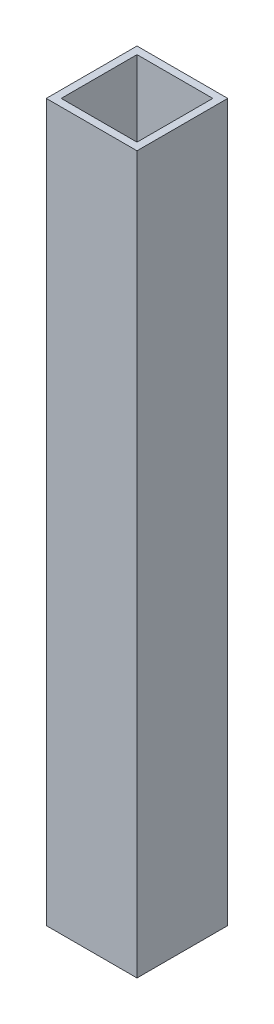
ISO-10303-21;
HEADER;
FILE_DESCRIPTION(('STEP AP214'),'2;1');
FILE_NAME('part.step','',(''),(''),'','','');
FILE_SCHEMA(('AUTOMOTIVE_DESIGN { 1 0 10303 214 1 1 1 1 }'));
ENDSEC;
DATA;
#1=APPLICATION_CONTEXT('core data for automotive mechanical design processes');
#2=APPLICATION_PROTOCOL_DEFINITION('international standard','automotive_design',2000,#1);
#3=PRODUCT_CONTEXT('',#1,'mechanical');
#4=PRODUCT('Part','Part','',(#3));
#5=PRODUCT_RELATED_PRODUCT_CATEGORY('part','',(#4));
#6=PRODUCT_DEFINITION_FORMATION('','',#4);
#7=PRODUCT_DEFINITION_CONTEXT('part definition',#1,'design');
#8=PRODUCT_DEFINITION('design','',#6,#7);
#9=PRODUCT_DEFINITION_SHAPE('','',#8);
#10=(LENGTH_UNIT() NAMED_UNIT(*) SI_UNIT(.MILLI.,.METRE.));
#11=(NAMED_UNIT(*) PLANE_ANGLE_UNIT() SI_UNIT($,.RADIAN.));
#12=(NAMED_UNIT(*) SI_UNIT($,.STERADIAN.) SOLID_ANGLE_UNIT());
#13=UNCERTAINTY_MEASURE_WITH_UNIT(LENGTH_MEASURE(1.E-05),#10,'distance_accuracy_value','');
#14=(GEOMETRIC_REPRESENTATION_CONTEXT(3) GLOBAL_UNCERTAINTY_ASSIGNED_CONTEXT((#13)) GLOBAL_UNIT_ASSIGNED_CONTEXT((#10,
#11,#12)) REPRESENTATION_CONTEXT('',''));
#15=CARTESIAN_POINT('',(0.,0.,0.));
#16=DIRECTION('',(0.,0.,1.));
#17=DIRECTION('',(1.,0.,0.));
#18=AXIS2_PLACEMENT_3D('',#15,#16,#17);
#19=CARTESIAN_POINT('',(0.,76.2,0.));
#20=DIRECTION('',(0.,1.,0.));
#21=DIRECTION('',(0.,0.,1.));
#22=AXIS2_PLACEMENT_3D('',#19,#20,#21);
#23=PLANE('',#22);
#24=DIRECTION('',(0.,0.,-1.));
#25=VECTOR('',#24,1.);
#26=CARTESIAN_POINT('',(9.652,76.2,-9.652));
#27=LINE('',#26,#25);
#28=CARTESIAN_POINT('',(9.652,76.2,9.652));
#29=VERTEX_POINT('',#28);
#30=CARTESIAN_POINT('',(9.652,76.2,-9.652));
#31=VERTEX_POINT('',#30);
#32=EDGE_CURVE('E134',#29,#31,#27,.T.);
#33=ORIENTED_EDGE('',*,*,#32,.T.);
#34=DIRECTION('',(-1.,0.,0.));
#35=VECTOR('',#34,1.);
#36=CARTESIAN_POINT('',(-9.652,76.2,-9.652));
#37=LINE('',#36,#35);
#38=CARTESIAN_POINT('',(-9.652,76.2,-9.652));
#39=VERTEX_POINT('',#38);
#40=EDGE_CURVE('E137',#31,#39,#37,.T.);
#41=ORIENTED_EDGE('',*,*,#40,.T.);
#42=DIRECTION('',(0.,0.,1.));
#43=VECTOR('',#42,1.);
#44=CARTESIAN_POINT('',(-9.652,76.2,-9.652));
#45=LINE('',#44,#43);
#46=CARTESIAN_POINT('',(-9.652,76.2,9.652));
#47=VERTEX_POINT('',#46);
#48=EDGE_CURVE('E140',#39,#47,#45,.T.);
#49=ORIENTED_EDGE('',*,*,#48,.T.);
#50=DIRECTION('',(1.,0.,0.));
#51=VECTOR('',#50,1.);
#52=CARTESIAN_POINT('',(-9.652,76.2,9.652));
#53=LINE('',#52,#51);
#54=EDGE_CURVE('E142',#47,#29,#53,.T.);
#55=ORIENTED_EDGE('',*,*,#54,.T.);
#56=EDGE_LOOP('',(#33,#41,#49,#55));
#57=FACE_BOUND('',#56,.T.);
#58=DIRECTION('',(1.,0.,0.));
#59=VECTOR('',#58,1.);
#60=CARTESIAN_POINT('',(-8.0645,76.2,8.0645));
#61=LINE('',#60,#59);
#62=CARTESIAN_POINT('',(-8.0645,76.2,8.0645));
#63=VERTEX_POINT('',#62);
#64=CARTESIAN_POINT('',(8.0645,76.2,8.0645));
#65=VERTEX_POINT('',#64);
#66=EDGE_CURVE('E106',#63,#65,#61,.T.);
#67=ORIENTED_EDGE('',*,*,#66,.F.);
#68=DIRECTION('',(0.,0.,1.));
#69=VECTOR('',#68,1.);
#70=CARTESIAN_POINT('',(-8.0645,76.2,-8.0645));
#71=LINE('',#70,#69);
#72=CARTESIAN_POINT('',(-8.0645,76.2,-8.0645));
#73=VERTEX_POINT('',#72);
#74=EDGE_CURVE('E98',#73,#63,#71,.T.);
#75=ORIENTED_EDGE('',*,*,#74,.F.);
#76=DIRECTION('',(-1.,0.,0.));
#77=VECTOR('',#76,1.);
#78=CARTESIAN_POINT('',(-8.0645,76.2,-8.0645));
#79=LINE('',#78,#77);
#80=CARTESIAN_POINT('',(8.0645,76.2,-8.0645));
#81=VERTEX_POINT('',#80);
#82=EDGE_CURVE('E120',#81,#73,#79,.T.);
#83=ORIENTED_EDGE('',*,*,#82,.F.);
#84=DIRECTION('',(0.,0.,-1.));
#85=VECTOR('',#84,1.);
#86=CARTESIAN_POINT('',(8.0645,76.2,-8.0645));
#87=LINE('',#86,#85);
#88=EDGE_CURVE('E118',#65,#81,#87,.T.);
#89=ORIENTED_EDGE('',*,*,#88,.F.);
#90=EDGE_LOOP('',(#67,#75,#83,#89));
#91=FACE_BOUND('',#90,.T.);
#92=ADVANCED_FACE('F33',(#57,#91),#23,.T.);
#93=CARTESIAN_POINT('',(0.,-76.2,0.));
#94=DIRECTION('',(0.,1.,0.));
#95=DIRECTION('',(0.,0.,1.));
#96=AXIS2_PLACEMENT_3D('',#93,#94,#95);
#97=PLANE('',#96);
#98=DIRECTION('',(0.,0.,-1.));
#99=VECTOR('',#98,1.);
#100=CARTESIAN_POINT('',(9.652,-76.2,-9.652));
#101=LINE('',#100,#99);
#102=CARTESIAN_POINT('',(9.652,-76.2,9.652));
#103=VERTEX_POINT('',#102);
#104=CARTESIAN_POINT('',(9.652,-76.2,-9.652));
#105=VERTEX_POINT('',#104);
#106=EDGE_CURVE('E114',#103,#105,#101,.T.);
#107=ORIENTED_EDGE('',*,*,#106,.F.);
#108=DIRECTION('',(1.,0.,0.));
#109=VECTOR('',#108,1.);
#110=CARTESIAN_POINT('',(-9.652,-76.2,9.652));
#111=LINE('',#110,#109);
#112=CARTESIAN_POINT('',(-9.652,-76.2,9.652));
#113=VERTEX_POINT('',#112);
#114=EDGE_CURVE('E138',#113,#103,#111,.T.);
#115=ORIENTED_EDGE('',*,*,#114,.F.);
#116=DIRECTION('',(0.,0.,1.));
#117=VECTOR('',#116,1.);
#118=CARTESIAN_POINT('',(-9.652,-76.2,-9.652));
#119=LINE('',#118,#117);
#120=CARTESIAN_POINT('',(-9.652,-76.2,-9.652));
#121=VERTEX_POINT('',#120);
#122=EDGE_CURVE('E149',#121,#113,#119,.T.);
#123=ORIENTED_EDGE('',*,*,#122,.F.);
#124=DIRECTION('',(-1.,0.,0.));
#125=VECTOR('',#124,1.);
#126=CARTESIAN_POINT('',(-9.652,-76.2,-9.652));
#127=LINE('',#126,#125);
#128=EDGE_CURVE('E147',#105,#121,#127,.T.);
#129=ORIENTED_EDGE('',*,*,#128,.F.);
#130=EDGE_LOOP('',(#107,#115,#123,#129));
#131=FACE_BOUND('',#130,.T.);
#132=DIRECTION('',(0.,0.,1.));
#133=VECTOR('',#132,1.);
#134=CARTESIAN_POINT('',(-8.0645,-76.2,-8.0645));
#135=LINE('',#134,#133);
#136=CARTESIAN_POINT('',(-8.0645,-76.2,-8.0645));
#137=VERTEX_POINT('',#136);
#138=CARTESIAN_POINT('',(-8.0645,-76.2,8.0645));
#139=VERTEX_POINT('',#138);
#140=EDGE_CURVE('E56',#137,#139,#135,.T.);
#141=ORIENTED_EDGE('',*,*,#140,.T.);
#142=DIRECTION('',(1.,0.,0.));
#143=VECTOR('',#142,1.);
#144=CARTESIAN_POINT('',(-8.0645,-76.2,8.0645));
#145=LINE('',#144,#143);
#146=CARTESIAN_POINT('',(8.0645,-76.2,8.0645));
#147=VERTEX_POINT('',#146);
#148=EDGE_CURVE('E113',#139,#147,#145,.T.);
#149=ORIENTED_EDGE('',*,*,#148,.T.);
#150=DIRECTION('',(0.,0.,-1.));
#151=VECTOR('',#150,1.);
#152=CARTESIAN_POINT('',(8.0645,-76.2,-8.0645));
#153=LINE('',#152,#151);
#154=CARTESIAN_POINT('',(8.0645,-76.2,-8.0645));
#155=VERTEX_POINT('',#154);
#156=EDGE_CURVE('E126',#147,#155,#153,.T.);
#157=ORIENTED_EDGE('',*,*,#156,.T.);
#158=DIRECTION('',(-1.,0.,0.));
#159=VECTOR('',#158,1.);
#160=CARTESIAN_POINT('',(-8.0645,-76.2,-8.0645));
#161=LINE('',#160,#159);
#162=EDGE_CURVE('E107',#155,#137,#161,.T.);
#163=ORIENTED_EDGE('',*,*,#162,.T.);
#164=EDGE_LOOP('',(#141,#149,#157,#163));
#165=FACE_BOUND('',#164,.T.);
#166=ADVANCED_FACE('F167',(#131,#165),#97,.F.);
#167=CARTESIAN_POINT('',(9.652,76.2,-9.652));
#168=DIRECTION('',(-1.,0.,0.));
#169=DIRECTION('',(0.,0.,1.));
#170=AXIS2_PLACEMENT_3D('',#167,#168,#169);
#171=PLANE('',#170);
#172=ORIENTED_EDGE('',*,*,#106,.T.);
#173=DIRECTION('',(0.,-1.,0.));
#174=VECTOR('',#173,1.);
#175=CARTESIAN_POINT('',(9.652,76.2,-9.652));
#176=LINE('',#175,#174);
#177=EDGE_CURVE('E11',#31,#105,#176,.T.);
#178=ORIENTED_EDGE('',*,*,#177,.F.);
#179=ORIENTED_EDGE('',*,*,#32,.F.);
#180=DIRECTION('',(0.,-1.,0.));
#181=VECTOR('',#180,1.);
#182=CARTESIAN_POINT('',(9.652,76.2,9.652));
#183=LINE('',#182,#181);
#184=EDGE_CURVE('E144',#29,#103,#183,.T.);
#185=ORIENTED_EDGE('',*,*,#184,.T.);
#186=EDGE_LOOP('',(#172,#178,#179,#185));
#187=FACE_BOUND('',#186,.T.);
#188=ADVANCED_FACE('F35',(#187),#171,.F.);
#189=CARTESIAN_POINT('',(-9.652,76.2,-9.652));
#190=DIRECTION('',(0.,0.,1.));
#191=DIRECTION('',(1.,0.,0.));
#192=AXIS2_PLACEMENT_3D('',#189,#190,#191);
#193=PLANE('',#192);
#194=ORIENTED_EDGE('',*,*,#128,.T.);
#195=DIRECTION('',(0.,-1.,0.));
#196=VECTOR('',#195,1.);
#197=CARTESIAN_POINT('',(-9.652,76.2,-9.652));
#198=LINE('',#197,#196);
#199=EDGE_CURVE('E41',#39,#121,#198,.T.);
#200=ORIENTED_EDGE('',*,*,#199,.F.);
#201=ORIENTED_EDGE('',*,*,#40,.F.);
#202=ORIENTED_EDGE('',*,*,#177,.T.);
#203=EDGE_LOOP('',(#194,#200,#201,#202));
#204=FACE_BOUND('',#203,.T.);
#205=ADVANCED_FACE('F177',(#204),#193,.F.);
#206=CARTESIAN_POINT('',(-9.652,76.2,-9.652));
#207=DIRECTION('',(1.,0.,0.));
#208=DIRECTION('',(0.,0.,-1.));
#209=AXIS2_PLACEMENT_3D('',#206,#207,#208);
#210=PLANE('',#209);
#211=ORIENTED_EDGE('',*,*,#122,.T.);
#212=DIRECTION('',(0.,-1.,0.));
#213=VECTOR('',#212,1.);
#214=CARTESIAN_POINT('',(-9.652,76.2,9.652));
#215=LINE('',#214,#213);
#216=EDGE_CURVE('E154',#47,#113,#215,.T.);
#217=ORIENTED_EDGE('',*,*,#216,.F.);
#218=ORIENTED_EDGE('',*,*,#48,.F.);
#219=ORIENTED_EDGE('',*,*,#199,.T.);
#220=EDGE_LOOP('',(#211,#217,#218,#219));
#221=FACE_BOUND('',#220,.T.);
#222=ADVANCED_FACE('F161',(#221),#210,.F.);
#223=CARTESIAN_POINT('',(-9.652,76.2,9.652));
#224=DIRECTION('',(0.,0.,-1.));
#225=DIRECTION('',(-1.,0.,0.));
#226=AXIS2_PLACEMENT_3D('',#223,#224,#225);
#227=PLANE('',#226);
#228=ORIENTED_EDGE('',*,*,#114,.T.);
#229=ORIENTED_EDGE('',*,*,#184,.F.);
#230=ORIENTED_EDGE('',*,*,#54,.F.);
#231=ORIENTED_EDGE('',*,*,#216,.T.);
#232=EDGE_LOOP('',(#228,#229,#230,#231));
#233=FACE_BOUND('',#232,.T.);
#234=ADVANCED_FACE('F171',(#233),#227,.F.);
#235=CARTESIAN_POINT('',(-8.0645,76.2,-8.0645));
#236=DIRECTION('',(1.,0.,0.));
#237=DIRECTION('',(0.,0.,-1.));
#238=AXIS2_PLACEMENT_3D('',#235,#236,#237);
#239=PLANE('',#238);
#240=ORIENTED_EDGE('',*,*,#140,.F.);
#241=DIRECTION('',(0.,-1.,0.));
#242=VECTOR('',#241,1.);
#243=CARTESIAN_POINT('',(-8.0645,76.2,-8.0645));
#244=LINE('',#243,#242);
#245=EDGE_CURVE('E102',#73,#137,#244,.T.);
#246=ORIENTED_EDGE('',*,*,#245,.F.);
#247=ORIENTED_EDGE('',*,*,#74,.T.);
#248=DIRECTION('',(0.,-1.,0.));
#249=VECTOR('',#248,1.);
#250=CARTESIAN_POINT('',(-8.0645,76.2,8.0645));
#251=LINE('',#250,#249);
#252=EDGE_CURVE('E101',#63,#139,#251,.T.);
#253=ORIENTED_EDGE('',*,*,#252,.T.);
#254=EDGE_LOOP('',(#240,#246,#247,#253));
#255=FACE_BOUND('',#254,.T.);
#256=ADVANCED_FACE('F100',(#255),#239,.T.);
#257=CARTESIAN_POINT('',(-8.0645,76.2,8.0645));
#258=DIRECTION('',(0.,0.,-1.));
#259=DIRECTION('',(-1.,0.,0.));
#260=AXIS2_PLACEMENT_3D('',#257,#258,#259);
#261=PLANE('',#260);
#262=ORIENTED_EDGE('',*,*,#148,.F.);
#263=ORIENTED_EDGE('',*,*,#252,.F.);
#264=ORIENTED_EDGE('',*,*,#66,.T.);
#265=DIRECTION('',(0.,-1.,0.));
#266=VECTOR('',#265,1.);
#267=CARTESIAN_POINT('',(8.0645,76.2,8.0645));
#268=LINE('',#267,#266);
#269=EDGE_CURVE('E115',#65,#147,#268,.T.);
#270=ORIENTED_EDGE('',*,*,#269,.T.);
#271=EDGE_LOOP('',(#262,#263,#264,#270));
#272=FACE_BOUND('',#271,.T.);
#273=ADVANCED_FACE('F110',(#272),#261,.T.);
#274=CARTESIAN_POINT('',(8.0645,76.2,-8.0645));
#275=DIRECTION('',(-1.,0.,0.));
#276=DIRECTION('',(0.,0.,1.));
#277=AXIS2_PLACEMENT_3D('',#274,#275,#276);
#278=PLANE('',#277);
#279=ORIENTED_EDGE('',*,*,#156,.F.);
#280=ORIENTED_EDGE('',*,*,#269,.F.);
#281=ORIENTED_EDGE('',*,*,#88,.T.);
#282=DIRECTION('',(0.,-1.,0.));
#283=VECTOR('',#282,1.);
#284=CARTESIAN_POINT('',(8.0645,76.2,-8.0645));
#285=LINE('',#284,#283);
#286=EDGE_CURVE('E48',#81,#155,#285,.T.);
#287=ORIENTED_EDGE('',*,*,#286,.T.);
#288=EDGE_LOOP('',(#279,#280,#281,#287));
#289=FACE_BOUND('',#288,.T.);
#290=ADVANCED_FACE('F200',(#289),#278,.T.);
#291=CARTESIAN_POINT('',(-8.0645,76.2,-8.0645));
#292=DIRECTION('',(0.,0.,1.));
#293=DIRECTION('',(1.,0.,0.));
#294=AXIS2_PLACEMENT_3D('',#291,#292,#293);
#295=PLANE('',#294);
#296=ORIENTED_EDGE('',*,*,#162,.F.);
#297=ORIENTED_EDGE('',*,*,#286,.F.);
#298=ORIENTED_EDGE('',*,*,#82,.T.);
#299=ORIENTED_EDGE('',*,*,#245,.T.);
#300=EDGE_LOOP('',(#296,#297,#298,#299));
#301=FACE_BOUND('',#300,.T.);
#302=ADVANCED_FACE('F204',(#301),#295,.T.);
#303=CLOSED_SHELL('',(#92,#166,#188,#205,#222,#234,#256,#273,#290,#302));
#304=MANIFOLD_SOLID_BREP('B2',#303);
#305=ADVANCED_BREP_SHAPE_REPRESENTATION('',(#18,#304),#14);
#306=SHAPE_DEFINITION_REPRESENTATION(#9,#305);
ENDSEC;
END-ISO-10303-21;
